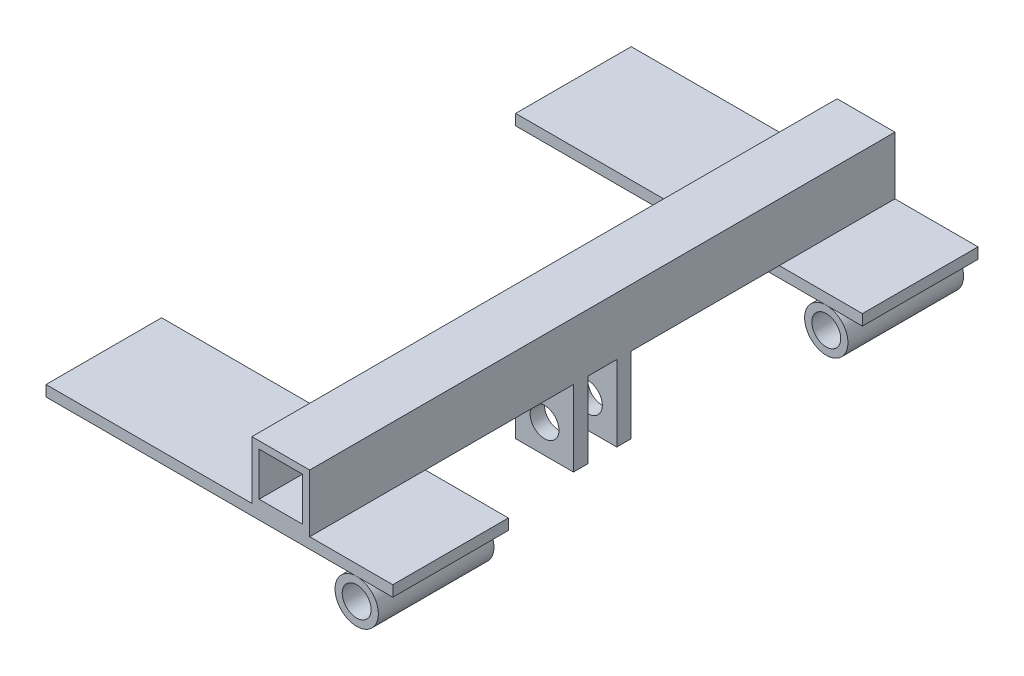
ISO-10303-21;
HEADER;
FILE_DESCRIPTION(('STEP AP214'),'2;1');
FILE_NAME('part.step','',(''),(''),'','','');
FILE_SCHEMA(('AUTOMOTIVE_DESIGN { 1 0 10303 214 1 1 1 1 }'));
ENDSEC;
DATA;
#1=APPLICATION_CONTEXT('core data for automotive mechanical design processes');
#2=APPLICATION_PROTOCOL_DEFINITION('international standard','automotive_design',2000,#1);
#3=PRODUCT_CONTEXT('',#1,'mechanical');
#4=PRODUCT('Part','Part','',(#3));
#5=PRODUCT_RELATED_PRODUCT_CATEGORY('part','',(#4));
#6=PRODUCT_DEFINITION_FORMATION('','',#4);
#7=PRODUCT_DEFINITION_CONTEXT('part definition',#1,'design');
#8=PRODUCT_DEFINITION('design','',#6,#7);
#9=PRODUCT_DEFINITION_SHAPE('','',#8);
#10=(LENGTH_UNIT() NAMED_UNIT(*) SI_UNIT(.MILLI.,.METRE.));
#11=(NAMED_UNIT(*) PLANE_ANGLE_UNIT() SI_UNIT($,.RADIAN.));
#12=(NAMED_UNIT(*) SI_UNIT($,.STERADIAN.) SOLID_ANGLE_UNIT());
#13=UNCERTAINTY_MEASURE_WITH_UNIT(LENGTH_MEASURE(1.E-05),#10,'distance_accuracy_value','');
#14=(GEOMETRIC_REPRESENTATION_CONTEXT(3) GLOBAL_UNCERTAINTY_ASSIGNED_CONTEXT((#13)) GLOBAL_UNIT_ASSIGNED_CONTEXT((#10,
#11,#12)) REPRESENTATION_CONTEXT('',''));
#15=CARTESIAN_POINT('',(0.,0.,0.));
#16=DIRECTION('',(0.,0.,1.));
#17=DIRECTION('',(1.,0.,0.));
#18=AXIS2_PLACEMENT_3D('',#15,#16,#17);
#19=CARTESIAN_POINT('',(0.,0.,257.175));
#20=DIRECTION('',(0.,0.,-1.));
#21=DIRECTION('',(-1.,0.,0.));
#22=AXIS2_PLACEMENT_3D('',#19,#20,#21);
#23=CYLINDRICAL_SURFACE('',#22,19.05);
#24=CARTESIAN_POINT('',(0.,0.,-257.175));
#25=DIRECTION('',(0.,0.,1.));
#26=DIRECTION('',(1.,0.,0.));
#27=AXIS2_PLACEMENT_3D('',#24,#25,#26);
#28=CIRCLE('',#27,19.05);
#29=CARTESIAN_POINT('',(19.05,0.,-257.175));
#30=VERTEX_POINT('',#29);
#31=EDGE_CURVE('E55',#30,#30,#28,.T.);
#32=ORIENTED_EDGE('',*,*,#31,.T.);
#33=EDGE_LOOP('',(#32));
#34=FACE_BOUND('',#33,.T.);
#35=CARTESIAN_POINT('',(0.,0.,-155.575));
#36=DIRECTION('',(0.,0.,-1.));
#37=DIRECTION('',(-1.,0.,0.));
#38=AXIS2_PLACEMENT_3D('',#35,#36,#37);
#39=CIRCLE('',#38,19.05);
#40=CARTESIAN_POINT('',(-19.05,0.,-155.575));
#41=VERTEX_POINT('',#40);
#42=EDGE_CURVE('E45',#41,#41,#39,.T.);
#43=ORIENTED_EDGE('',*,*,#42,.T.);
#44=EDGE_LOOP('',(#43));
#45=FACE_BOUND('',#44,.T.);
#46=ADVANCED_FACE('F41',(#34,#45),#23,.T.);
#47=CARTESIAN_POINT('',(0.,0.,257.175));
#48=DIRECTION('',(0.,0.,-1.));
#49=DIRECTION('',(-1.,0.,0.));
#50=AXIS2_PLACEMENT_3D('',#47,#48,#49);
#51=CYLINDRICAL_SURFACE('',#50,12.7);
#52=CARTESIAN_POINT('',(0.,0.,-155.575));
#53=DIRECTION('',(0.,0.,-1.));
#54=DIRECTION('',(-1.,0.,0.));
#55=AXIS2_PLACEMENT_3D('',#52,#53,#54);
#56=CIRCLE('',#55,12.7);
#57=CARTESIAN_POINT('',(-12.7,0.,-155.575));
#58=VERTEX_POINT('',#57);
#59=EDGE_CURVE('E11',#58,#58,#56,.T.);
#60=ORIENTED_EDGE('',*,*,#59,.F.);
#61=EDGE_LOOP('',(#60));
#62=FACE_BOUND('',#61,.T.);
#63=CARTESIAN_POINT('',(0.,0.,-257.175));
#64=DIRECTION('',(0.,0.,1.));
#65=DIRECTION('',(1.,0.,0.));
#66=AXIS2_PLACEMENT_3D('',#63,#64,#65);
#67=CIRCLE('',#66,12.7);
#68=CARTESIAN_POINT('',(12.7,0.,-257.175));
#69=VERTEX_POINT('',#68);
#70=EDGE_CURVE('E49',#69,#69,#67,.T.);
#71=ORIENTED_EDGE('',*,*,#70,.F.);
#72=EDGE_LOOP('',(#71));
#73=FACE_BOUND('',#72,.T.);
#74=ADVANCED_FACE('F43',(#62,#73),#51,.F.);
#75=CARTESIAN_POINT('',(0.,0.,-257.175));
#76=DIRECTION('',(0.,0.,1.));
#77=DIRECTION('',(1.,0.,0.));
#78=AXIS2_PLACEMENT_3D('',#75,#76,#77);
#79=PLANE('',#78);
#80=ORIENTED_EDGE('',*,*,#31,.F.);
#81=EDGE_LOOP('',(#80));
#82=FACE_BOUND('',#81,.T.);
#83=ORIENTED_EDGE('',*,*,#70,.T.);
#84=EDGE_LOOP('',(#83));
#85=FACE_BOUND('',#84,.T.);
#86=ADVANCED_FACE('F65',(#82,#85),#79,.F.);
#87=CARTESIAN_POINT('',(-19.05,-38.1,-155.575));
#88=DIRECTION('',(0.,0.,-1.));
#89=DIRECTION('',(-1.,0.,0.));
#90=AXIS2_PLACEMENT_3D('',#87,#88,#89);
#91=PLANE('',#90);
#92=ORIENTED_EDGE('',*,*,#59,.T.);
#93=EDGE_LOOP('',(#92));
#94=FACE_BOUND('',#93,.T.);
#95=ORIENTED_EDGE('',*,*,#42,.F.);
#96=EDGE_LOOP('',(#95));
#97=FACE_BOUND('',#96,.T.);
#98=ADVANCED_FACE('F63',(#94,#97),#91,.F.);
#99=CLOSED_SHELL('',(#46,#74,#86,#98));
#100=MANIFOLD_SOLID_BREP('B2',#99);
#101=CARTESIAN_POINT('',(-92.075,28.575,329.017048968553));
#102=DIRECTION('',(0.,1.,0.));
#103=DIRECTION('',(-1.,0.,0.));
#104=AXIS2_PLACEMENT_3D('',#101,#102,#103);
#105=PLANE('',#104);
#106=DIRECTION('',(-1.,0.,0.));
#107=VECTOR('',#106,1.);
#108=CARTESIAN_POINT('',(-92.075,28.575,-25.4));
#109=LINE('',#108,#107);
#110=CARTESIAN_POINT('',(-41.275,28.575,-25.4));
#111=VERTEX_POINT('',#110);
#112=CARTESIAN_POINT('',(-92.075,28.575,-25.4));
#113=VERTEX_POINT('',#112);
#114=EDGE_CURVE('E122',#111,#113,#109,.T.);
#115=ORIENTED_EDGE('',*,*,#114,.T.);
#116=DIRECTION('',(0.,0.,-1.));
#117=VECTOR('',#116,1.);
#118=CARTESIAN_POINT('',(-92.075,28.575,329.017048968553));
#119=LINE('',#118,#117);
#120=CARTESIAN_POINT('',(-92.075,28.575,-155.575));
#121=VERTEX_POINT('',#120);
#122=EDGE_CURVE('E330',#113,#121,#119,.T.);
#123=ORIENTED_EDGE('',*,*,#122,.T.);
#124=DIRECTION('',(1.,0.,0.));
#125=VECTOR('',#124,1.);
#126=CARTESIAN_POINT('',(31.75,28.575,-155.575));
#127=LINE('',#126,#125);
#128=CARTESIAN_POINT('',(-41.275,28.575,-155.575));
#129=VERTEX_POINT('',#128);
#130=EDGE_CURVE('E480',#121,#129,#127,.T.);
#131=ORIENTED_EDGE('',*,*,#130,.T.);
#132=DIRECTION('',(0.,0.,-1.));
#133=VECTOR('',#132,1.);
#134=CARTESIAN_POINT('',(-41.275,28.575,329.017048968553));
#135=LINE('',#134,#133);
#136=EDGE_CURVE('E304',#111,#129,#135,.T.);
#137=ORIENTED_EDGE('',*,*,#136,.F.);
#138=EDGE_LOOP('',(#115,#123,#131,#137));
#139=FACE_BOUND('',#138,.T.);
#140=ADVANCED_FACE('F105',(#139),#105,.F.);
#141=DIRECTION('',(-1.,0.,0.));
#142=VECTOR('',#141,1.);
#143=CARTESIAN_POINT('',(-41.275,28.575,-12.7));
#144=LINE('',#143,#142);
#145=CARTESIAN_POINT('',(-41.275,28.575,-12.7));
#146=VERTEX_POINT('',#145);
#147=CARTESIAN_POINT('',(-92.075,28.575,-12.7));
#148=VERTEX_POINT('',#147);
#149=EDGE_CURVE('E284',#146,#148,#144,.T.);
#150=ORIENTED_EDGE('',*,*,#149,.F.);
#151=CARTESIAN_POINT('',(-41.275,28.575,12.7));
#152=VERTEX_POINT('',#151);
#153=EDGE_CURVE('E296',#152,#146,#135,.T.);
#154=ORIENTED_EDGE('',*,*,#153,.F.);
#155=DIRECTION('',(1.,0.,0.));
#156=VECTOR('',#155,1.);
#157=CARTESIAN_POINT('',(-41.275,28.575,12.7));
#158=LINE('',#157,#156);
#159=CARTESIAN_POINT('',(-92.075,28.575,12.7));
#160=VERTEX_POINT('',#159);
#161=EDGE_CURVE('E499',#160,#152,#158,.T.);
#162=ORIENTED_EDGE('',*,*,#161,.F.);
#163=EDGE_CURVE('E298',#160,#148,#119,.T.);
#164=ORIENTED_EDGE('',*,*,#163,.T.);
#165=EDGE_LOOP('',(#150,#154,#162,#164));
#166=FACE_BOUND('',#165,.T.);
#167=ADVANCED_FACE('F294',(#166),#105,.F.);
#168=CARTESIAN_POINT('',(-92.075,28.575,155.575));
#169=VERTEX_POINT('',#168);
#170=CARTESIAN_POINT('',(-92.075,28.575,25.4));
#171=VERTEX_POINT('',#170);
#172=EDGE_CURVE('E312',#169,#171,#119,.T.);
#173=ORIENTED_EDGE('',*,*,#172,.T.);
#174=DIRECTION('',(-1.,0.,0.));
#175=VECTOR('',#174,1.);
#176=CARTESIAN_POINT('',(-92.075,28.575,25.4));
#177=LINE('',#176,#175);
#178=CARTESIAN_POINT('',(-41.275,28.575,25.4));
#179=VERTEX_POINT('',#178);
#180=EDGE_CURVE('E519',#179,#171,#177,.T.);
#181=ORIENTED_EDGE('',*,*,#180,.F.);
#182=CARTESIAN_POINT('',(-41.275,28.575,155.575));
#183=VERTEX_POINT('',#182);
#184=EDGE_CURVE('E303',#183,#179,#135,.T.);
#185=ORIENTED_EDGE('',*,*,#184,.F.);
#186=DIRECTION('',(-1.,0.,0.));
#187=VECTOR('',#186,1.);
#188=CARTESIAN_POINT('',(31.75,28.575,155.575));
#189=LINE('',#188,#187);
#190=EDGE_CURVE('E382',#183,#169,#189,.T.);
#191=ORIENTED_EDGE('',*,*,#190,.T.);
#192=EDGE_LOOP('',(#173,#181,#185,#191));
#193=FACE_BOUND('',#192,.T.);
#194=ADVANCED_FACE('F589',(#193),#105,.F.);
#195=CARTESIAN_POINT('',(31.75,28.575,155.575));
#196=DIRECTION('',(0.,1.,0.));
#197=DIRECTION('',(0.,0.,1.));
#198=AXIS2_PLACEMENT_3D('',#195,#196,#197);
#199=PLANE('',#198);
#200=DIRECTION('',(1.,0.,0.));
#201=VECTOR('',#200,1.);
#202=CARTESIAN_POINT('',(31.7500000000001,28.575,257.175));
#203=LINE('',#202,#201);
#204=CARTESIAN_POINT('',(-273.05,28.575,257.175));
#205=VERTEX_POINT('',#204);
#206=CARTESIAN_POINT('',(-92.075,28.575,257.175));
#207=VERTEX_POINT('',#206);
#208=EDGE_CURVE('E392',#205,#207,#203,.T.);
#209=ORIENTED_EDGE('',*,*,#208,.T.);
#210=EDGE_CURVE('E321',#207,#169,#119,.T.);
#211=ORIENTED_EDGE('',*,*,#210,.T.);
#212=CARTESIAN_POINT('',(-273.05,28.575,155.575));
#213=VERTEX_POINT('',#212);
#214=EDGE_CURVE('E377',#169,#213,#189,.T.);
#215=ORIENTED_EDGE('',*,*,#214,.T.);
#216=DIRECTION('',(0.,0.,1.));
#217=VECTOR('',#216,1.);
#218=CARTESIAN_POINT('',(-273.05,28.575,257.175));
#219=LINE('',#218,#217);
#220=EDGE_CURVE('E381',#213,#205,#219,.T.);
#221=ORIENTED_EDGE('',*,*,#220,.T.);
#222=EDGE_LOOP('',(#209,#211,#215,#221));
#223=FACE_BOUND('',#222,.T.);
#224=ADVANCED_FACE('F595',(#223),#199,.T.);
#225=CARTESIAN_POINT('',(31.7500000000001,28.575,257.175));
#226=DIRECTION('',(-1.,0.,0.));
#227=DIRECTION('',(0.,0.,1.));
#228=AXIS2_PLACEMENT_3D('',#225,#226,#227);
#229=PLANE('',#228);
#230=DIRECTION('',(0.,0.,-1.));
#231=VECTOR('',#230,1.);
#232=CARTESIAN_POINT('',(31.7500000000001,19.05,257.175));
#233=LINE('',#232,#231);
#234=CARTESIAN_POINT('',(31.7500000000001,19.05,257.175));
#235=VERTEX_POINT('',#234);
#236=CARTESIAN_POINT('',(31.75,19.05,155.575));
#237=VERTEX_POINT('',#236);
#238=EDGE_CURVE('E363',#235,#237,#233,.T.);
#239=ORIENTED_EDGE('',*,*,#238,.T.);
#240=DIRECTION('',(0.,-1.,0.));
#241=VECTOR('',#240,1.);
#242=CARTESIAN_POINT('',(31.75,28.575,155.575));
#243=LINE('',#242,#241);
#244=CARTESIAN_POINT('',(31.75,28.575,155.575));
#245=VERTEX_POINT('',#244);
#246=EDGE_CURVE('E39',#245,#237,#243,.T.);
#247=ORIENTED_EDGE('',*,*,#246,.F.);
#248=DIRECTION('',(0.,0.,-1.));
#249=VECTOR('',#248,1.);
#250=CARTESIAN_POINT('',(31.7500000000001,28.575,257.175));
#251=LINE('',#250,#249);
#252=CARTESIAN_POINT('',(31.7500000000001,28.575,257.175));
#253=VERTEX_POINT('',#252);
#254=EDGE_CURVE('E374',#253,#245,#251,.T.);
#255=ORIENTED_EDGE('',*,*,#254,.F.);
#256=DIRECTION('',(0.,-1.,0.));
#257=VECTOR('',#256,1.);
#258=CARTESIAN_POINT('',(31.7500000000001,28.575,257.175));
#259=LINE('',#258,#257);
#260=EDGE_CURVE('E387',#253,#235,#259,.T.);
#261=ORIENTED_EDGE('',*,*,#260,.T.);
#262=EDGE_LOOP('',(#239,#247,#255,#261));
#263=FACE_BOUND('',#262,.T.);
#264=ADVANCED_FACE('F107',(#263),#229,.F.);
#265=CARTESIAN_POINT('',(31.75,28.575,155.575));
#266=DIRECTION('',(0.,0.,1.));
#267=DIRECTION('',(1.,0.,0.));
#268=AXIS2_PLACEMENT_3D('',#265,#266,#267);
#269=PLANE('',#268);
#270=DIRECTION('',(-1.,0.,0.));
#271=VECTOR('',#270,1.);
#272=CARTESIAN_POINT('',(31.75,19.05,155.575));
#273=LINE('',#272,#271);
#274=CARTESIAN_POINT('',(-273.05,19.05,155.575));
#275=VERTEX_POINT('',#274);
#276=EDGE_CURVE('E368',#237,#275,#273,.T.);
#277=ORIENTED_EDGE('',*,*,#276,.T.);
#278=DIRECTION('',(0.,-1.,0.));
#279=VECTOR('',#278,1.);
#280=CARTESIAN_POINT('',(-273.05,28.575,155.575));
#281=LINE('',#280,#279);
#282=EDGE_CURVE('E114',#213,#275,#281,.T.);
#283=ORIENTED_EDGE('',*,*,#282,.F.);
#284=ORIENTED_EDGE('',*,*,#214,.F.);
#285=ORIENTED_EDGE('',*,*,#190,.F.);
#286=EDGE_CURVE('E378',#245,#183,#189,.T.);
#287=ORIENTED_EDGE('',*,*,#286,.F.);
#288=ORIENTED_EDGE('',*,*,#246,.T.);
#289=EDGE_LOOP('',(#277,#283,#284,#285,#287,#288));
#290=FACE_BOUND('',#289,.T.);
#291=ADVANCED_FACE('F413',(#290),#269,.F.);
#292=CARTESIAN_POINT('',(-273.05,28.575,257.175));
#293=DIRECTION('',(1.,0.,0.));
#294=DIRECTION('',(0.,0.,-1.));
#295=AXIS2_PLACEMENT_3D('',#292,#293,#294);
#296=PLANE('',#295);
#297=DIRECTION('',(0.,0.,1.));
#298=VECTOR('',#297,1.);
#299=CARTESIAN_POINT('',(-273.05,19.05,257.175));
#300=LINE('',#299,#298);
#301=CARTESIAN_POINT('',(-273.05,19.05,257.175));
#302=VERTEX_POINT('',#301);
#303=EDGE_CURVE('E370',#275,#302,#300,.T.);
#304=ORIENTED_EDGE('',*,*,#303,.T.);
#305=DIRECTION('',(0.,-1.,0.));
#306=VECTOR('',#305,1.);
#307=CARTESIAN_POINT('',(-273.05,28.575,257.175));
#308=LINE('',#307,#306);
#309=EDGE_CURVE('E395',#205,#302,#308,.T.);
#310=ORIENTED_EDGE('',*,*,#309,.F.);
#311=ORIENTED_EDGE('',*,*,#220,.F.);
#312=ORIENTED_EDGE('',*,*,#282,.T.);
#313=EDGE_LOOP('',(#304,#310,#311,#312));
#314=FACE_BOUND('',#313,.T.);
#315=ADVANCED_FACE('F607',(#314),#296,.F.);
#316=CARTESIAN_POINT('',(31.7500000000001,28.575,257.175));
#317=DIRECTION('',(0.,0.,-1.));
#318=DIRECTION('',(-1.,0.,0.));
#319=AXIS2_PLACEMENT_3D('',#316,#317,#318);
#320=PLANE('',#319);
#321=DIRECTION('',(1.,0.,0.));
#322=VECTOR('',#321,1.);
#323=CARTESIAN_POINT('',(31.7500000000001,19.05,257.175));
#324=LINE('',#323,#322);
#325=EDGE_CURVE('E372',#302,#235,#324,.T.);
#326=ORIENTED_EDGE('',*,*,#325,.T.);
#327=ORIENTED_EDGE('',*,*,#260,.F.);
#328=CARTESIAN_POINT('',(-41.275,28.575,257.175));
#329=VERTEX_POINT('',#328);
#330=EDGE_CURVE('E384',#329,#253,#203,.T.);
#331=ORIENTED_EDGE('',*,*,#330,.F.);
#332=DIRECTION('',(0.,-1.,0.));
#333=VECTOR('',#332,1.);
#334=CARTESIAN_POINT('',(-41.275,79.375,257.175));
#335=LINE('',#334,#333);
#336=CARTESIAN_POINT('',(-41.275,79.375,257.175));
#337=VERTEX_POINT('',#336);
#338=EDGE_CURVE('E308',#337,#329,#335,.T.);
#339=ORIENTED_EDGE('',*,*,#338,.F.);
#340=DIRECTION('',(1.,0.,0.));
#341=VECTOR('',#340,1.);
#342=CARTESIAN_POINT('',(-92.075,79.375,257.175));
#343=LINE('',#342,#341);
#344=CARTESIAN_POINT('',(-92.075,79.375,257.175));
#345=VERTEX_POINT('',#344);
#346=EDGE_CURVE('E320',#345,#337,#343,.T.);
#347=ORIENTED_EDGE('',*,*,#346,.F.);
#348=DIRECTION('',(0.,1.,0.));
#349=VECTOR('',#348,1.);
#350=CARTESIAN_POINT('',(-92.075,79.375,257.175));
#351=LINE('',#350,#349);
#352=EDGE_CURVE('E339',#207,#345,#351,.T.);
#353=ORIENTED_EDGE('',*,*,#352,.F.);
#354=ORIENTED_EDGE('',*,*,#208,.F.);
#355=ORIENTED_EDGE('',*,*,#309,.T.);
#356=EDGE_LOOP('',(#326,#327,#331,#339,#347,#353,#354,#355));
#357=FACE_BOUND('',#356,.T.);
#358=DIRECTION('',(0.,1.,0.));
#359=VECTOR('',#358,1.);
#360=CARTESIAN_POINT('',(-85.725,73.025,257.175));
#361=LINE('',#360,#359);
#362=CARTESIAN_POINT('',(-85.725,34.925,257.175));
#363=VERTEX_POINT('',#362);
#364=CARTESIAN_POINT('',(-85.725,73.025,257.175));
#365=VERTEX_POINT('',#364);
#366=EDGE_CURVE('E356',#363,#365,#361,.T.);
#367=ORIENTED_EDGE('',*,*,#366,.T.);
#368=DIRECTION('',(1.,0.,0.));
#369=VECTOR('',#368,1.);
#370=CARTESIAN_POINT('',(-85.725,73.025,257.175));
#371=LINE('',#370,#369);
#372=CARTESIAN_POINT('',(-47.625,73.025,257.175));
#373=VERTEX_POINT('',#372);
#374=EDGE_CURVE('E360',#365,#373,#371,.T.);
#375=ORIENTED_EDGE('',*,*,#374,.T.);
#376=DIRECTION('',(0.,-1.,0.));
#377=VECTOR('',#376,1.);
#378=CARTESIAN_POINT('',(-47.625,73.025,257.175));
#379=LINE('',#378,#377);
#380=CARTESIAN_POINT('',(-47.625,34.925,257.175));
#381=VERTEX_POINT('',#380);
#382=EDGE_CURVE('E364',#373,#381,#379,.T.);
#383=ORIENTED_EDGE('',*,*,#382,.T.);
#384=DIRECTION('',(-1.,0.,0.));
#385=VECTOR('',#384,1.);
#386=CARTESIAN_POINT('',(-85.725,34.925,257.175));
#387=LINE('',#386,#385);
#388=EDGE_CURVE('E361',#381,#363,#387,.T.);
#389=ORIENTED_EDGE('',*,*,#388,.T.);
#390=EDGE_LOOP('',(#367,#375,#383,#389));
#391=FACE_BOUND('',#390,.T.);
#392=ADVANCED_FACE('F417',(#357,#391),#320,.F.);
#393=EDGE_CURVE('E307',#329,#183,#135,.T.);
#394=ORIENTED_EDGE('',*,*,#393,.F.);
#395=ORIENTED_EDGE('',*,*,#330,.T.);
#396=ORIENTED_EDGE('',*,*,#254,.T.);
#397=ORIENTED_EDGE('',*,*,#286,.T.);
#398=EDGE_LOOP('',(#394,#395,#396,#397));
#399=FACE_BOUND('',#398,.T.);
#400=ADVANCED_FACE('F416',(#399),#199,.T.);
#401=CARTESIAN_POINT('',(31.75,19.05,155.575));
#402=DIRECTION('',(0.,1.,0.));
#403=DIRECTION('',(0.,0.,1.));
#404=AXIS2_PLACEMENT_3D('',#401,#402,#403);
#405=PLANE('',#404);
#406=ORIENTED_EDGE('',*,*,#238,.F.);
#407=ORIENTED_EDGE('',*,*,#325,.F.);
#408=ORIENTED_EDGE('',*,*,#303,.F.);
#409=ORIENTED_EDGE('',*,*,#276,.F.);
#410=EDGE_LOOP('',(#406,#407,#408,#409));
#411=FACE_BOUND('',#410,.T.);
#412=ADVANCED_FACE('F409',(#411),#405,.F.);
#413=CARTESIAN_POINT('',(-92.075,79.375,329.017048968553));
#414=DIRECTION('',(1.,0.,0.));
#415=DIRECTION('',(0.,1.,0.));
#416=AXIS2_PLACEMENT_3D('',#413,#414,#415);
#417=PLANE('',#416);
#418=ORIENTED_EDGE('',*,*,#210,.F.);
#419=ORIENTED_EDGE('',*,*,#352,.T.);
#420=DIRECTION('',(0.,0.,-1.));
#421=VECTOR('',#420,1.);
#422=CARTESIAN_POINT('',(-92.075,79.375,329.017048968553));
#423=LINE('',#422,#421);
#424=CARTESIAN_POINT('',(-92.075,79.375,-257.175));
#425=VERTEX_POINT('',#424);
#426=EDGE_CURVE('E334',#345,#425,#423,.T.);
#427=ORIENTED_EDGE('',*,*,#426,.T.);
#428=DIRECTION('',(0.,1.,0.));
#429=VECTOR('',#428,1.);
#430=CARTESIAN_POINT('',(-92.075,79.375,-257.175));
#431=LINE('',#430,#429);
#432=CARTESIAN_POINT('',(-92.075,28.575,-257.175));
#433=VERTEX_POINT('',#432);
#434=EDGE_CURVE('E429',#433,#425,#431,.T.);
#435=ORIENTED_EDGE('',*,*,#434,.F.);
#436=DIRECTION('',(0.,0.,1.));
#437=VECTOR('',#436,1.);
#438=CARTESIAN_POINT('',(-92.075,28.575,329.017048968553));
#439=LINE('',#438,#437);
#440=EDGE_CURVE('E438',#433,#121,#439,.T.);
#441=ORIENTED_EDGE('',*,*,#440,.T.);
#442=ORIENTED_EDGE('',*,*,#122,.F.);
#443=DIRECTION('',(0.,-1.,0.));
#444=VECTOR('',#443,1.);
#445=CARTESIAN_POINT('',(-92.075,28.575,-25.4));
#446=LINE('',#445,#444);
#447=CARTESIAN_POINT('',(-92.075,-38.1,-25.4));
#448=VERTEX_POINT('',#447);
#449=EDGE_CURVE('E535',#113,#448,#446,.T.);
#450=ORIENTED_EDGE('',*,*,#449,.T.);
#451=DIRECTION('',(0.,0.,-1.));
#452=VECTOR('',#451,1.);
#453=CARTESIAN_POINT('',(-92.075,-38.1,25.4));
#454=LINE('',#453,#452);
#455=CARTESIAN_POINT('',(-92.075,-38.1,-12.7));
#456=VERTEX_POINT('',#455);
#457=EDGE_CURVE('E505',#456,#448,#454,.T.);
#458=ORIENTED_EDGE('',*,*,#457,.F.);
#459=DIRECTION('',(0.,1.,0.));
#460=VECTOR('',#459,1.);
#461=CARTESIAN_POINT('',(-92.075,-38.101,-12.7));
#462=LINE('',#461,#460);
#463=EDGE_CURVE('E289',#456,#148,#462,.T.);
#464=ORIENTED_EDGE('',*,*,#463,.T.);
#465=ORIENTED_EDGE('',*,*,#163,.F.);
#466=DIRECTION('',(0.,1.,0.));
#467=VECTOR('',#466,1.);
#468=CARTESIAN_POINT('',(-92.075,-38.101,12.7));
#469=LINE('',#468,#467);
#470=CARTESIAN_POINT('',(-92.075,-38.1,12.7));
#471=VERTEX_POINT('',#470);
#472=EDGE_CURVE('E512',#471,#160,#469,.T.);
#473=ORIENTED_EDGE('',*,*,#472,.F.);
#474=DIRECTION('',(0.,0.,-1.));
#475=VECTOR('',#474,1.);
#476=CARTESIAN_POINT('',(-92.075,-38.1,25.4));
#477=LINE('',#476,#475);
#478=CARTESIAN_POINT('',(-92.075,-38.1,25.4));
#479=VERTEX_POINT('',#478);
#480=EDGE_CURVE('E502',#479,#471,#477,.T.);
#481=ORIENTED_EDGE('',*,*,#480,.F.);
#482=DIRECTION('',(0.,-1.,0.));
#483=VECTOR('',#482,1.);
#484=CARTESIAN_POINT('',(-92.075,28.575,25.4));
#485=LINE('',#484,#483);
#486=EDGE_CURVE('E522',#171,#479,#485,.T.);
#487=ORIENTED_EDGE('',*,*,#486,.F.);
#488=ORIENTED_EDGE('',*,*,#172,.F.);
#489=EDGE_LOOP('',(#418,#419,#427,#435,#441,#442,#450,#458,#464,#465,#473,#481,#487,#488));
#490=FACE_BOUND('',#489,.T.);
#491=ADVANCED_FACE('F546',(#490),#417,.F.);
#492=CARTESIAN_POINT('',(-41.275,79.375,329.017048968553));
#493=DIRECTION('',(-1.,0.,0.));
#494=DIRECTION('',(0.,-1.,0.));
#495=AXIS2_PLACEMENT_3D('',#492,#493,#494);
#496=PLANE('',#495);
#497=DIRECTION('',(0.,0.,-1.));
#498=VECTOR('',#497,1.);
#499=CARTESIAN_POINT('',(-41.275,79.375,329.017048968553));
#500=LINE('',#499,#498);
#501=CARTESIAN_POINT('',(-41.275,79.375,-257.175));
#502=VERTEX_POINT('',#501);
#503=EDGE_CURVE('E315',#337,#502,#500,.T.);
#504=ORIENTED_EDGE('',*,*,#503,.F.);
#505=ORIENTED_EDGE('',*,*,#338,.T.);
#506=ORIENTED_EDGE('',*,*,#393,.T.);
#507=ORIENTED_EDGE('',*,*,#184,.T.);
#508=DIRECTION('',(0.,1.,0.));
#509=VECTOR('',#508,1.);
#510=CARTESIAN_POINT('',(-41.275,-38.1,25.4));
#511=LINE('',#510,#509);
#512=CARTESIAN_POINT('',(-41.275,-38.1,25.4));
#513=VERTEX_POINT('',#512);
#514=EDGE_CURVE('E513',#513,#179,#511,.T.);
#515=ORIENTED_EDGE('',*,*,#514,.F.);
#516=DIRECTION('',(0.,0.,-1.));
#517=VECTOR('',#516,1.);
#518=CARTESIAN_POINT('',(-41.275,-38.1,25.4));
#519=LINE('',#518,#517);
#520=CARTESIAN_POINT('',(-41.275,-38.1,12.7));
#521=VERTEX_POINT('',#520);
#522=EDGE_CURVE('E500',#513,#521,#519,.T.);
#523=ORIENTED_EDGE('',*,*,#522,.T.);
#524=DIRECTION('',(0.,1.,0.));
#525=VECTOR('',#524,1.);
#526=CARTESIAN_POINT('',(-41.275,-38.101,12.7));
#527=LINE('',#526,#525);
#528=EDGE_CURVE('E130',#521,#152,#527,.T.);
#529=ORIENTED_EDGE('',*,*,#528,.T.);
#530=ORIENTED_EDGE('',*,*,#153,.T.);
#531=DIRECTION('',(0.,1.,0.));
#532=VECTOR('',#531,1.);
#533=CARTESIAN_POINT('',(-41.275,-38.101,-12.7));
#534=LINE('',#533,#532);
#535=CARTESIAN_POINT('',(-41.275,-38.1,-12.7));
#536=VERTEX_POINT('',#535);
#537=EDGE_CURVE('E281',#536,#146,#534,.T.);
#538=ORIENTED_EDGE('',*,*,#537,.F.);
#539=DIRECTION('',(0.,0.,-1.));
#540=VECTOR('',#539,1.);
#541=CARTESIAN_POINT('',(-41.275,-38.1,25.4));
#542=LINE('',#541,#540);
#543=CARTESIAN_POINT('',(-41.275,-38.1,-25.4));
#544=VERTEX_POINT('',#543);
#545=EDGE_CURVE('E528',#536,#544,#542,.T.);
#546=ORIENTED_EDGE('',*,*,#545,.T.);
#547=DIRECTION('',(0.,1.,0.));
#548=VECTOR('',#547,1.);
#549=CARTESIAN_POINT('',(-41.275,-38.1,-25.4));
#550=LINE('',#549,#548);
#551=EDGE_CURVE('E530',#544,#111,#550,.T.);
#552=ORIENTED_EDGE('',*,*,#551,.T.);
#553=ORIENTED_EDGE('',*,*,#136,.T.);
#554=DIRECTION('',(0.,0.,-1.));
#555=VECTOR('',#554,1.);
#556=CARTESIAN_POINT('',(-41.275,28.575,329.017048968553));
#557=LINE('',#556,#555);
#558=CARTESIAN_POINT('',(-41.275,28.575,-257.175));
#559=VERTEX_POINT('',#558);
#560=EDGE_CURVE('E463',#129,#559,#557,.T.);
#561=ORIENTED_EDGE('',*,*,#560,.T.);
#562=DIRECTION('',(0.,-1.,0.));
#563=VECTOR('',#562,1.);
#564=CARTESIAN_POINT('',(-41.275,79.375,-257.175));
#565=LINE('',#564,#563);
#566=EDGE_CURVE('E422',#502,#559,#565,.T.);
#567=ORIENTED_EDGE('',*,*,#566,.F.);
#568=EDGE_LOOP('',(#504,#505,#506,#507,#515,#523,#529,#530,#538,#546,#552,#553,#561,#567));
#569=FACE_BOUND('',#568,.T.);
#570=ADVANCED_FACE('F302',(#569),#496,.F.);
#571=CARTESIAN_POINT('',(-92.075,79.375,329.017048968553));
#572=DIRECTION('',(0.,-1.,0.));
#573=DIRECTION('',(0.,0.,-1.));
#574=AXIS2_PLACEMENT_3D('',#571,#572,#573);
#575=PLANE('',#574);
#576=ORIENTED_EDGE('',*,*,#426,.F.);
#577=ORIENTED_EDGE('',*,*,#346,.T.);
#578=ORIENTED_EDGE('',*,*,#503,.T.);
#579=DIRECTION('',(1.,0.,0.));
#580=VECTOR('',#579,1.);
#581=CARTESIAN_POINT('',(-92.075,79.375,-257.175));
#582=LINE('',#581,#580);
#583=EDGE_CURVE('E427',#425,#502,#582,.T.);
#584=ORIENTED_EDGE('',*,*,#583,.F.);
#585=EDGE_LOOP('',(#576,#577,#578,#584));
#586=FACE_BOUND('',#585,.T.);
#587=ADVANCED_FACE('F426',(#586),#575,.F.);
#588=CARTESIAN_POINT('',(-85.725,73.025,329.017048968553));
#589=DIRECTION('',(1.,0.,0.));
#590=DIRECTION('',(0.,0.,-1.));
#591=AXIS2_PLACEMENT_3D('',#588,#589,#590);
#592=PLANE('',#591);
#593=ORIENTED_EDGE('',*,*,#366,.F.);
#594=DIRECTION('',(0.,0.,-1.));
#595=VECTOR('',#594,1.);
#596=CARTESIAN_POINT('',(-85.725,34.925,329.017048968553));
#597=LINE('',#596,#595);
#598=CARTESIAN_POINT('',(-85.725,34.925,-257.175));
#599=VERTEX_POINT('',#598);
#600=EDGE_CURVE('E348',#363,#599,#597,.T.);
#601=ORIENTED_EDGE('',*,*,#600,.T.);
#602=DIRECTION('',(0.,1.,0.));
#603=VECTOR('',#602,1.);
#604=CARTESIAN_POINT('',(-85.725,73.025,-257.175));
#605=LINE('',#604,#603);
#606=CARTESIAN_POINT('',(-85.725,73.025,-257.175));
#607=VERTEX_POINT('',#606);
#608=EDGE_CURVE('E431',#599,#607,#605,.T.);
#609=ORIENTED_EDGE('',*,*,#608,.T.);
#610=DIRECTION('',(0.,0.,-1.));
#611=VECTOR('',#610,1.);
#612=CARTESIAN_POINT('',(-85.725,73.025,329.017048968553));
#613=LINE('',#612,#611);
#614=EDGE_CURVE('E354',#365,#607,#613,.T.);
#615=ORIENTED_EDGE('',*,*,#614,.F.);
#616=EDGE_LOOP('',(#593,#601,#609,#615));
#617=FACE_BOUND('',#616,.T.);
#618=ADVANCED_FACE('F793',(#617),#592,.T.);
#619=CARTESIAN_POINT('',(-85.725,34.925,329.017048968553));
#620=DIRECTION('',(0.,1.,0.));
#621=DIRECTION('',(-1.,0.,0.));
#622=AXIS2_PLACEMENT_3D('',#619,#620,#621);
#623=PLANE('',#622);
#624=ORIENTED_EDGE('',*,*,#388,.F.);
#625=DIRECTION('',(0.,0.,-1.));
#626=VECTOR('',#625,1.);
#627=CARTESIAN_POINT('',(-47.625,34.925,329.017048968553));
#628=LINE('',#627,#626);
#629=CARTESIAN_POINT('',(-47.625,34.925,-257.175));
#630=VERTEX_POINT('',#629);
#631=EDGE_CURVE('E350',#381,#630,#628,.T.);
#632=ORIENTED_EDGE('',*,*,#631,.T.);
#633=DIRECTION('',(-1.,0.,0.));
#634=VECTOR('',#633,1.);
#635=CARTESIAN_POINT('',(-85.725,34.925,-257.175));
#636=LINE('',#635,#634);
#637=EDGE_CURVE('E433',#630,#599,#636,.T.);
#638=ORIENTED_EDGE('',*,*,#637,.T.);
#639=ORIENTED_EDGE('',*,*,#600,.F.);
#640=EDGE_LOOP('',(#624,#632,#638,#639));
#641=FACE_BOUND('',#640,.T.);
#642=ADVANCED_FACE('F801',(#641),#623,.T.);
#643=CARTESIAN_POINT('',(-47.625,73.025,329.017048968553));
#644=DIRECTION('',(-1.,0.,0.));
#645=DIRECTION('',(0.,-1.,0.));
#646=AXIS2_PLACEMENT_3D('',#643,#644,#645);
#647=PLANE('',#646);
#648=ORIENTED_EDGE('',*,*,#382,.F.);
#649=DIRECTION('',(0.,0.,-1.));
#650=VECTOR('',#649,1.);
#651=CARTESIAN_POINT('',(-47.625,73.025,329.017048968553));
#652=LINE('',#651,#650);
#653=CARTESIAN_POINT('',(-47.625,73.025,-257.175));
#654=VERTEX_POINT('',#653);
#655=EDGE_CURVE('E352',#373,#654,#652,.T.);
#656=ORIENTED_EDGE('',*,*,#655,.T.);
#657=DIRECTION('',(0.,-1.,0.));
#658=VECTOR('',#657,1.);
#659=CARTESIAN_POINT('',(-47.625,73.025,-257.175));
#660=LINE('',#659,#658);
#661=EDGE_CURVE('E345',#654,#630,#660,.T.);
#662=ORIENTED_EDGE('',*,*,#661,.T.);
#663=ORIENTED_EDGE('',*,*,#631,.F.);
#664=EDGE_LOOP('',(#648,#656,#662,#663));
#665=FACE_BOUND('',#664,.T.);
#666=ADVANCED_FACE('F448',(#665),#647,.T.);
#667=CARTESIAN_POINT('',(-85.725,73.025,329.017048968553));
#668=DIRECTION('',(0.,-1.,0.));
#669=DIRECTION('',(0.,0.,-1.));
#670=AXIS2_PLACEMENT_3D('',#667,#668,#669);
#671=PLANE('',#670);
#672=ORIENTED_EDGE('',*,*,#374,.F.);
#673=ORIENTED_EDGE('',*,*,#614,.T.);
#674=DIRECTION('',(1.,0.,0.));
#675=VECTOR('',#674,1.);
#676=CARTESIAN_POINT('',(-85.725,73.025,-257.175));
#677=LINE('',#676,#675);
#678=EDGE_CURVE('E454',#607,#654,#677,.T.);
#679=ORIENTED_EDGE('',*,*,#678,.T.);
#680=ORIENTED_EDGE('',*,*,#655,.F.);
#681=EDGE_LOOP('',(#672,#673,#679,#680));
#682=FACE_BOUND('',#681,.T.);
#683=ADVANCED_FACE('F452',(#682),#671,.T.);
#684=CARTESIAN_POINT('',(31.75,28.575,-257.175));
#685=DIRECTION('',(0.,0.,1.));
#686=DIRECTION('',(1.,0.,0.));
#687=AXIS2_PLACEMENT_3D('',#684,#685,#686);
#688=PLANE('',#687);
#689=ORIENTED_EDGE('',*,*,#434,.T.);
#690=ORIENTED_EDGE('',*,*,#583,.T.);
#691=ORIENTED_EDGE('',*,*,#566,.T.);
#692=DIRECTION('',(-1.,0.,0.));
#693=VECTOR('',#692,1.);
#694=CARTESIAN_POINT('',(31.75,28.575,-257.175));
#695=LINE('',#694,#693);
#696=CARTESIAN_POINT('',(31.75,28.575,-257.175));
#697=VERTEX_POINT('',#696);
#698=EDGE_CURVE('E484',#697,#559,#695,.T.);
#699=ORIENTED_EDGE('',*,*,#698,.F.);
#700=DIRECTION('',(0.,-1.,0.));
#701=VECTOR('',#700,1.);
#702=CARTESIAN_POINT('',(31.75,28.575,-257.175));
#703=LINE('',#702,#701);
#704=CARTESIAN_POINT('',(31.75,19.05,-257.175));
#705=VERTEX_POINT('',#704);
#706=EDGE_CURVE('E465',#697,#705,#703,.T.);
#707=ORIENTED_EDGE('',*,*,#706,.T.);
#708=DIRECTION('',(-1.,0.,0.));
#709=VECTOR('',#708,1.);
#710=CARTESIAN_POINT('',(31.75,19.05,-257.175));
#711=LINE('',#710,#709);
#712=CARTESIAN_POINT('',(-273.05,19.05,-257.175));
#713=VERTEX_POINT('',#712);
#714=EDGE_CURVE('E494',#705,#713,#711,.T.);
#715=ORIENTED_EDGE('',*,*,#714,.T.);
#716=DIRECTION('',(0.,-1.,0.));
#717=VECTOR('',#716,1.);
#718=CARTESIAN_POINT('',(-273.05,28.575,-257.175));
#719=LINE('',#718,#717);
#720=CARTESIAN_POINT('',(-273.05,28.575,-257.175));
#721=VERTEX_POINT('',#720);
#722=EDGE_CURVE('E468',#721,#713,#719,.T.);
#723=ORIENTED_EDGE('',*,*,#722,.F.);
#724=EDGE_CURVE('E486',#433,#721,#695,.T.);
#725=ORIENTED_EDGE('',*,*,#724,.F.);
#726=EDGE_LOOP('',(#689,#690,#691,#699,#707,#715,#723,#725));
#727=FACE_BOUND('',#726,.T.);
#728=ORIENTED_EDGE('',*,*,#637,.F.);
#729=ORIENTED_EDGE('',*,*,#661,.F.);
#730=ORIENTED_EDGE('',*,*,#678,.F.);
#731=ORIENTED_EDGE('',*,*,#608,.F.);
#732=EDGE_LOOP('',(#728,#729,#730,#731));
#733=FACE_BOUND('',#732,.T.);
#734=ADVANCED_FACE('F566',(#727,#733),#688,.F.);
#735=CARTESIAN_POINT('',(31.75,28.575,-257.175));
#736=DIRECTION('',(0.,1.,0.));
#737=DIRECTION('',(0.,0.,1.));
#738=AXIS2_PLACEMENT_3D('',#735,#736,#737);
#739=PLANE('',#738);
#740=ORIENTED_EDGE('',*,*,#440,.F.);
#741=ORIENTED_EDGE('',*,*,#724,.T.);
#742=DIRECTION('',(0.,0.,1.));
#743=VECTOR('',#742,1.);
#744=CARTESIAN_POINT('',(-273.05,28.575,-155.575));
#745=LINE('',#744,#743);
#746=CARTESIAN_POINT('',(-273.05,28.575,-155.575));
#747=VERTEX_POINT('',#746);
#748=EDGE_CURVE('E482',#721,#747,#745,.T.);
#749=ORIENTED_EDGE('',*,*,#748,.T.);
#750=EDGE_CURVE('E477',#747,#121,#127,.T.);
#751=ORIENTED_EDGE('',*,*,#750,.T.);
#752=EDGE_LOOP('',(#740,#741,#749,#751));
#753=FACE_BOUND('',#752,.T.);
#754=ADVANCED_FACE('F652',(#753),#739,.T.);
#755=ORIENTED_EDGE('',*,*,#560,.F.);
#756=CARTESIAN_POINT('',(31.75,28.575,-155.575));
#757=VERTEX_POINT('',#756);
#758=EDGE_CURVE('E481',#129,#757,#127,.T.);
#759=ORIENTED_EDGE('',*,*,#758,.T.);
#760=DIRECTION('',(0.,0.,-1.));
#761=VECTOR('',#760,1.);
#762=CARTESIAN_POINT('',(31.75,28.575,-155.575));
#763=LINE('',#762,#761);
#764=EDGE_CURVE('E487',#757,#697,#763,.T.);
#765=ORIENTED_EDGE('',*,*,#764,.T.);
#766=ORIENTED_EDGE('',*,*,#698,.T.);
#767=EDGE_LOOP('',(#755,#759,#765,#766));
#768=FACE_BOUND('',#767,.T.);
#769=ADVANCED_FACE('F558',(#768),#739,.T.);
#770=CARTESIAN_POINT('',(31.75,28.575,-155.575));
#771=DIRECTION('',(-1.,0.,0.));
#772=DIRECTION('',(0.,0.,1.));
#773=AXIS2_PLACEMENT_3D('',#770,#771,#772);
#774=PLANE('',#773);
#775=DIRECTION('',(0.,0.,-1.));
#776=VECTOR('',#775,1.);
#777=CARTESIAN_POINT('',(31.75,19.05,-155.575));
#778=LINE('',#777,#776);
#779=CARTESIAN_POINT('',(31.75,19.05,-155.575));
#780=VERTEX_POINT('',#779);
#781=EDGE_CURVE('E496',#780,#705,#778,.T.);
#782=ORIENTED_EDGE('',*,*,#781,.T.);
#783=ORIENTED_EDGE('',*,*,#706,.F.);
#784=ORIENTED_EDGE('',*,*,#764,.F.);
#785=DIRECTION('',(0.,-1.,0.));
#786=VECTOR('',#785,1.);
#787=CARTESIAN_POINT('',(31.75,28.575,-155.575));
#788=LINE('',#787,#786);
#789=EDGE_CURVE('E474',#757,#780,#788,.T.);
#790=ORIENTED_EDGE('',*,*,#789,.T.);
#791=EDGE_LOOP('',(#782,#783,#784,#790));
#792=FACE_BOUND('',#791,.T.);
#793=ADVANCED_FACE('F565',(#792),#774,.F.);
#794=CARTESIAN_POINT('',(-273.05,28.575,-155.575));
#795=DIRECTION('',(1.,0.,0.));
#796=DIRECTION('',(0.,0.,-1.));
#797=AXIS2_PLACEMENT_3D('',#794,#795,#796);
#798=PLANE('',#797);
#799=DIRECTION('',(0.,0.,1.));
#800=VECTOR('',#799,1.);
#801=CARTESIAN_POINT('',(-273.05,19.05,-155.575));
#802=LINE('',#801,#800);
#803=CARTESIAN_POINT('',(-273.05,19.05,-155.575));
#804=VERTEX_POINT('',#803);
#805=EDGE_CURVE('E492',#713,#804,#802,.T.);
#806=ORIENTED_EDGE('',*,*,#805,.T.);
#807=DIRECTION('',(0.,-1.,0.));
#808=VECTOR('',#807,1.);
#809=CARTESIAN_POINT('',(-273.05,28.575,-155.575));
#810=LINE('',#809,#808);
#811=EDGE_CURVE('E471',#747,#804,#810,.T.);
#812=ORIENTED_EDGE('',*,*,#811,.F.);
#813=ORIENTED_EDGE('',*,*,#748,.F.);
#814=ORIENTED_EDGE('',*,*,#722,.T.);
#815=EDGE_LOOP('',(#806,#812,#813,#814));
#816=FACE_BOUND('',#815,.T.);
#817=ADVANCED_FACE('F572',(#816),#798,.F.);
#818=CARTESIAN_POINT('',(31.75,28.575,-155.575));
#819=DIRECTION('',(0.,0.,-1.));
#820=DIRECTION('',(-1.,0.,0.));
#821=AXIS2_PLACEMENT_3D('',#818,#819,#820);
#822=PLANE('',#821);
#823=DIRECTION('',(1.,0.,0.));
#824=VECTOR('',#823,1.);
#825=CARTESIAN_POINT('',(31.75,19.05,-155.575));
#826=LINE('',#825,#824);
#827=EDGE_CURVE('E490',#804,#780,#826,.T.);
#828=ORIENTED_EDGE('',*,*,#827,.T.);
#829=ORIENTED_EDGE('',*,*,#789,.F.);
#830=ORIENTED_EDGE('',*,*,#758,.F.);
#831=ORIENTED_EDGE('',*,*,#130,.F.);
#832=ORIENTED_EDGE('',*,*,#750,.F.);
#833=ORIENTED_EDGE('',*,*,#811,.T.);
#834=EDGE_LOOP('',(#828,#829,#830,#831,#832,#833));
#835=FACE_BOUND('',#834,.T.);
#836=ADVANCED_FACE('F561',(#835),#822,.F.);
#837=CARTESIAN_POINT('',(31.75,19.05,-257.175));
#838=DIRECTION('',(0.,1.,0.));
#839=DIRECTION('',(0.,0.,1.));
#840=AXIS2_PLACEMENT_3D('',#837,#838,#839);
#841=PLANE('',#840);
#842=ORIENTED_EDGE('',*,*,#781,.F.);
#843=ORIENTED_EDGE('',*,*,#827,.F.);
#844=ORIENTED_EDGE('',*,*,#805,.F.);
#845=ORIENTED_EDGE('',*,*,#714,.F.);
#846=EDGE_LOOP('',(#842,#843,#844,#845));
#847=FACE_BOUND('',#846,.T.);
#848=ADVANCED_FACE('F574',(#847),#841,.F.);
#849=CARTESIAN_POINT('',(-92.075,-38.1,25.4));
#850=DIRECTION('',(0.,1.,0.));
#851=DIRECTION('',(0.,0.,1.));
#852=AXIS2_PLACEMENT_3D('',#849,#850,#851);
#853=PLANE('',#852);
#854=ORIENTED_EDGE('',*,*,#480,.T.);
#855=DIRECTION('',(-1.,0.,0.));
#856=VECTOR('',#855,1.);
#857=CARTESIAN_POINT('',(-41.275,-38.1,12.7));
#858=LINE('',#857,#856);
#859=EDGE_CURVE('E510',#521,#471,#858,.T.);
#860=ORIENTED_EDGE('',*,*,#859,.F.);
#861=ORIENTED_EDGE('',*,*,#522,.F.);
#862=DIRECTION('',(1.,0.,0.));
#863=VECTOR('',#862,1.);
#864=CARTESIAN_POINT('',(-92.075,-38.1,25.4));
#865=LINE('',#864,#863);
#866=EDGE_CURVE('E524',#479,#513,#865,.T.);
#867=ORIENTED_EDGE('',*,*,#866,.F.);
#868=EDGE_LOOP('',(#854,#860,#861,#867));
#869=FACE_BOUND('',#868,.T.);
#870=ADVANCED_FACE('F576',(#869),#853,.F.);
#871=CARTESIAN_POINT('',(-66.675,-12.7,25.4));
#872=DIRECTION('',(0.,0.,-1.));
#873=DIRECTION('',(-1.,0.,0.));
#874=AXIS2_PLACEMENT_3D('',#871,#872,#873);
#875=CYLINDRICAL_SURFACE('',#874,12.7000000000001);
#876=CARTESIAN_POINT('',(-66.675,-12.7,12.7));
#877=DIRECTION('',(0.,0.,1.));
#878=DIRECTION('',(1.,0.,0.));
#879=AXIS2_PLACEMENT_3D('',#876,#877,#878);
#880=CIRCLE('',#879,12.7000000000001);
#881=CARTESIAN_POINT('',(-53.9749999999999,-12.7,12.7));
#882=VERTEX_POINT('',#881);
#883=EDGE_CURVE('E506',#882,#882,#880,.F.);
#884=ORIENTED_EDGE('',*,*,#883,.T.);
#885=EDGE_LOOP('',(#884));
#886=FACE_BOUND('',#885,.T.);
#887=CARTESIAN_POINT('',(-66.675,-12.7,25.4));
#888=DIRECTION('',(0.,0.,1.));
#889=DIRECTION('',(1.,0.,0.));
#890=AXIS2_PLACEMENT_3D('',#887,#888,#889);
#891=CIRCLE('',#890,12.7000000000001);
#892=CARTESIAN_POINT('',(-53.9749999999999,-12.7,25.4));
#893=VERTEX_POINT('',#892);
#894=EDGE_CURVE('E509',#893,#893,#891,.T.);
#895=ORIENTED_EDGE('',*,*,#894,.T.);
#896=EDGE_LOOP('',(#895));
#897=FACE_BOUND('',#896,.T.);
#898=ADVANCED_FACE('F581',(#886,#897),#875,.F.);
#899=CARTESIAN_POINT('',(-41.275,28.575,25.4));
#900=DIRECTION('',(0.,0.,1.));
#901=DIRECTION('',(1.,0.,0.));
#902=AXIS2_PLACEMENT_3D('',#899,#900,#901);
#903=PLANE('',#902);
#904=ORIENTED_EDGE('',*,*,#180,.T.);
#905=ORIENTED_EDGE('',*,*,#486,.T.);
#906=ORIENTED_EDGE('',*,*,#866,.T.);
#907=ORIENTED_EDGE('',*,*,#514,.T.);
#908=EDGE_LOOP('',(#904,#905,#906,#907));
#909=FACE_BOUND('',#908,.T.);
#910=ORIENTED_EDGE('',*,*,#894,.F.);
#911=EDGE_LOOP('',(#910));
#912=FACE_BOUND('',#911,.T.);
#913=ADVANCED_FACE('F709',(#909,#912),#903,.T.);
#914=CARTESIAN_POINT('',(-41.275,-38.101,12.7));
#915=DIRECTION('',(0.,0.,1.));
#916=DIRECTION('',(1.,0.,0.));
#917=AXIS2_PLACEMENT_3D('',#914,#915,#916);
#918=PLANE('',#917);
#919=ORIENTED_EDGE('',*,*,#883,.F.);
#920=EDGE_LOOP('',(#919));
#921=FACE_BOUND('',#920,.T.);
#922=ORIENTED_EDGE('',*,*,#859,.T.);
#923=ORIENTED_EDGE('',*,*,#472,.T.);
#924=ORIENTED_EDGE('',*,*,#161,.T.);
#925=ORIENTED_EDGE('',*,*,#528,.F.);
#926=EDGE_LOOP('',(#922,#923,#924,#925));
#927=FACE_BOUND('',#926,.T.);
#928=ADVANCED_FACE('F717',(#921,#927),#918,.F.);
#929=CARTESIAN_POINT('',(-92.075,-38.1,25.4));
#930=DIRECTION('',(0.,1.,0.));
#931=DIRECTION('',(0.,0.,1.));
#932=AXIS2_PLACEMENT_3D('',#929,#930,#931);
#933=PLANE('',#932);
#934=ORIENTED_EDGE('',*,*,#545,.F.);
#935=DIRECTION('',(1.,0.,0.));
#936=VECTOR('',#935,1.);
#937=CARTESIAN_POINT('',(-41.275,-38.1,-12.7));
#938=LINE('',#937,#936);
#939=EDGE_CURVE('E287',#456,#536,#938,.T.);
#940=ORIENTED_EDGE('',*,*,#939,.F.);
#941=ORIENTED_EDGE('',*,*,#457,.T.);
#942=DIRECTION('',(1.,0.,0.));
#943=VECTOR('',#942,1.);
#944=CARTESIAN_POINT('',(-92.075,-38.1,-25.4));
#945=LINE('',#944,#943);
#946=EDGE_CURVE('E532',#448,#544,#945,.T.);
#947=ORIENTED_EDGE('',*,*,#946,.T.);
#948=EDGE_LOOP('',(#934,#940,#941,#947));
#949=FACE_BOUND('',#948,.T.);
#950=ADVANCED_FACE('F549',(#949),#933,.F.);
#951=CARTESIAN_POINT('',(-41.275,28.575,-25.4));
#952=DIRECTION('',(0.,0.,1.));
#953=DIRECTION('',(1.,0.,0.));
#954=AXIS2_PLACEMENT_3D('',#951,#952,#953);
#955=PLANE('',#954);
#956=ORIENTED_EDGE('',*,*,#114,.F.);
#957=ORIENTED_EDGE('',*,*,#551,.F.);
#958=ORIENTED_EDGE('',*,*,#946,.F.);
#959=ORIENTED_EDGE('',*,*,#449,.F.);
#960=EDGE_LOOP('',(#956,#957,#958,#959));
#961=FACE_BOUND('',#960,.T.);
#962=CARTESIAN_POINT('',(-66.675,-12.7,-25.4));
#963=DIRECTION('',(0.,0.,1.));
#964=DIRECTION('',(1.,0.,0.));
#965=AXIS2_PLACEMENT_3D('',#962,#963,#964);
#966=CIRCLE('',#965,12.7000000000001);
#967=CARTESIAN_POINT('',(-53.9749999999999,-12.7,-25.4));
#968=VERTEX_POINT('',#967);
#969=EDGE_CURVE('E539',#968,#968,#966,.T.);
#970=ORIENTED_EDGE('',*,*,#969,.T.);
#971=EDGE_LOOP('',(#970));
#972=FACE_BOUND('',#971,.T.);
#973=ADVANCED_FACE('F750',(#961,#972),#955,.F.);
#974=CARTESIAN_POINT('',(-66.675,-12.7,25.4));
#975=DIRECTION('',(0.,0.,-1.));
#976=DIRECTION('',(-1.,0.,0.));
#977=AXIS2_PLACEMENT_3D('',#974,#975,#976);
#978=CYLINDRICAL_SURFACE('',#977,12.7000000000001);
#979=CARTESIAN_POINT('',(-66.675,-12.7,-12.7));
#980=DIRECTION('',(0.,0.,-1.));
#981=DIRECTION('',(-1.,0.,0.));
#982=AXIS2_PLACEMENT_3D('',#979,#980,#981);
#983=CIRCLE('',#982,12.7000000000001);
#984=CARTESIAN_POINT('',(-79.3750000000001,-12.7,-12.7));
#985=VERTEX_POINT('',#984);
#986=EDGE_CURVE('E299',#985,#985,#983,.F.);
#987=ORIENTED_EDGE('',*,*,#986,.T.);
#988=EDGE_LOOP('',(#987));
#989=FACE_BOUND('',#988,.T.);
#990=ORIENTED_EDGE('',*,*,#969,.F.);
#991=EDGE_LOOP('',(#990));
#992=FACE_BOUND('',#991,.T.);
#993=ADVANCED_FACE('F758',(#989,#992),#978,.F.);
#994=CARTESIAN_POINT('',(-41.275,-38.101,-12.7));
#995=DIRECTION('',(0.,0.,-1.));
#996=DIRECTION('',(-1.,0.,0.));
#997=AXIS2_PLACEMENT_3D('',#994,#995,#996);
#998=PLANE('',#997);
#999=ORIENTED_EDGE('',*,*,#986,.F.);
#1000=EDGE_LOOP('',(#999));
#1001=FACE_BOUND('',#1000,.T.);
#1002=ORIENTED_EDGE('',*,*,#939,.T.);
#1003=ORIENTED_EDGE('',*,*,#537,.T.);
#1004=ORIENTED_EDGE('',*,*,#149,.T.);
#1005=ORIENTED_EDGE('',*,*,#463,.F.);
#1006=EDGE_LOOP('',(#1002,#1003,#1004,#1005));
#1007=FACE_BOUND('',#1006,.T.);
#1008=ADVANCED_FACE('F283',(#1001,#1007),#998,.F.);
#1009=CLOSED_SHELL('',(#140,#167,#194,#224,#264,#291,#315,#392,#400,#412,#491,#570,#587,#618,
#642,#666,#683,#734,#754,#769,#793,#817,#836,#848,#870,#898,#913,#928,#950,#973,#993,#1008));
#1010=MANIFOLD_SOLID_BREP('B6',#1009);
#1011=CARTESIAN_POINT('',(0.,0.,257.175));
#1012=DIRECTION('',(0.,0.,-1.));
#1013=DIRECTION('',(-1.,0.,0.));
#1014=AXIS2_PLACEMENT_3D('',#1011,#1012,#1013);
#1015=CYLINDRICAL_SURFACE('',#1014,19.05);
#1016=CARTESIAN_POINT('',(0.,0.,155.575));
#1017=DIRECTION('',(0.,0.,1.));
#1018=DIRECTION('',(1.,0.,0.));
#1019=AXIS2_PLACEMENT_3D('',#1016,#1017,#1018);
#1020=CIRCLE('',#1019,19.05);
#1021=CARTESIAN_POINT('',(19.05,0.,155.575));
#1022=VERTEX_POINT('',#1021);
#1023=EDGE_CURVE('E860',#1022,#1022,#1020,.T.);
#1024=ORIENTED_EDGE('',*,*,#1023,.T.);
#1025=EDGE_LOOP('',(#1024));
#1026=FACE_BOUND('',#1025,.T.);
#1027=CARTESIAN_POINT('',(0.,0.,257.175));
#1028=DIRECTION('',(0.,0.,1.));
#1029=DIRECTION('',(1.,0.,0.));
#1030=AXIS2_PLACEMENT_3D('',#1027,#1028,#1029);
#1031=CIRCLE('',#1030,19.05);
#1032=CARTESIAN_POINT('',(19.05,0.,257.175));
#1033=VERTEX_POINT('',#1032);
#1034=EDGE_CURVE('E104',#1033,#1033,#1031,.T.);
#1035=ORIENTED_EDGE('',*,*,#1034,.F.);
#1036=EDGE_LOOP('',(#1035));
#1037=FACE_BOUND('',#1036,.T.);
#1038=ADVANCED_FACE('F849',(#1026,#1037),#1015,.T.);
#1039=CARTESIAN_POINT('',(0.,0.,257.175));
#1040=DIRECTION('',(0.,0.,1.));
#1041=DIRECTION('',(1.,0.,0.));
#1042=AXIS2_PLACEMENT_3D('',#1039,#1040,#1041);
#1043=PLANE('',#1042);
#1044=ORIENTED_EDGE('',*,*,#1034,.T.);
#1045=EDGE_LOOP('',(#1044));
#1046=FACE_BOUND('',#1045,.T.);
#1047=CARTESIAN_POINT('',(0.,0.,257.175));
#1048=DIRECTION('',(0.,0.,1.));
#1049=DIRECTION('',(1.,0.,0.));
#1050=AXIS2_PLACEMENT_3D('',#1047,#1048,#1049);
#1051=CIRCLE('',#1050,12.7);
#1052=CARTESIAN_POINT('',(12.7,0.,257.175));
#1053=VERTEX_POINT('',#1052);
#1054=EDGE_CURVE('E856',#1053,#1053,#1051,.T.);
#1055=ORIENTED_EDGE('',*,*,#1054,.F.);
#1056=EDGE_LOOP('',(#1055));
#1057=FACE_BOUND('',#1056,.T.);
#1058=ADVANCED_FACE('F875',(#1046,#1057),#1043,.T.);
#1059=CARTESIAN_POINT('',(0.,0.,257.175));
#1060=DIRECTION('',(0.,0.,-1.));
#1061=DIRECTION('',(-1.,0.,0.));
#1062=AXIS2_PLACEMENT_3D('',#1059,#1060,#1061);
#1063=CYLINDRICAL_SURFACE('',#1062,12.7);
#1064=CARTESIAN_POINT('',(0.,0.,155.575));
#1065=DIRECTION('',(0.,0.,1.));
#1066=DIRECTION('',(1.,0.,0.));
#1067=AXIS2_PLACEMENT_3D('',#1064,#1065,#1066);
#1068=CIRCLE('',#1067,12.7);
#1069=CARTESIAN_POINT('',(12.7,0.,155.575));
#1070=VERTEX_POINT('',#1069);
#1071=EDGE_CURVE('E852',#1070,#1070,#1068,.T.);
#1072=ORIENTED_EDGE('',*,*,#1071,.F.);
#1073=EDGE_LOOP('',(#1072));
#1074=FACE_BOUND('',#1073,.T.);
#1075=ORIENTED_EDGE('',*,*,#1054,.T.);
#1076=EDGE_LOOP('',(#1075));
#1077=FACE_BOUND('',#1076,.T.);
#1078=ADVANCED_FACE('F872',(#1074,#1077),#1063,.F.);
#1079=CARTESIAN_POINT('',(-19.05,-38.1,155.575));
#1080=DIRECTION('',(0.,0.,1.));
#1081=DIRECTION('',(1.,0.,0.));
#1082=AXIS2_PLACEMENT_3D('',#1079,#1080,#1081);
#1083=PLANE('',#1082);
#1084=ORIENTED_EDGE('',*,*,#1071,.T.);
#1085=EDGE_LOOP('',(#1084));
#1086=FACE_BOUND('',#1085,.T.);
#1087=ORIENTED_EDGE('',*,*,#1023,.F.);
#1088=EDGE_LOOP('',(#1087));
#1089=FACE_BOUND('',#1088,.T.);
#1090=ADVANCED_FACE('F869',(#1086,#1089),#1083,.F.);
#1091=CLOSED_SHELL('',(#1038,#1058,#1078,#1090));
#1092=MANIFOLD_SOLID_BREP('B33',#1091);
#1093=ADVANCED_BREP_SHAPE_REPRESENTATION('',(#18,#100,#1010,#1092),#14);
#1094=SHAPE_DEFINITION_REPRESENTATION(#9,#1093);
ENDSEC;
END-ISO-10303-21;
